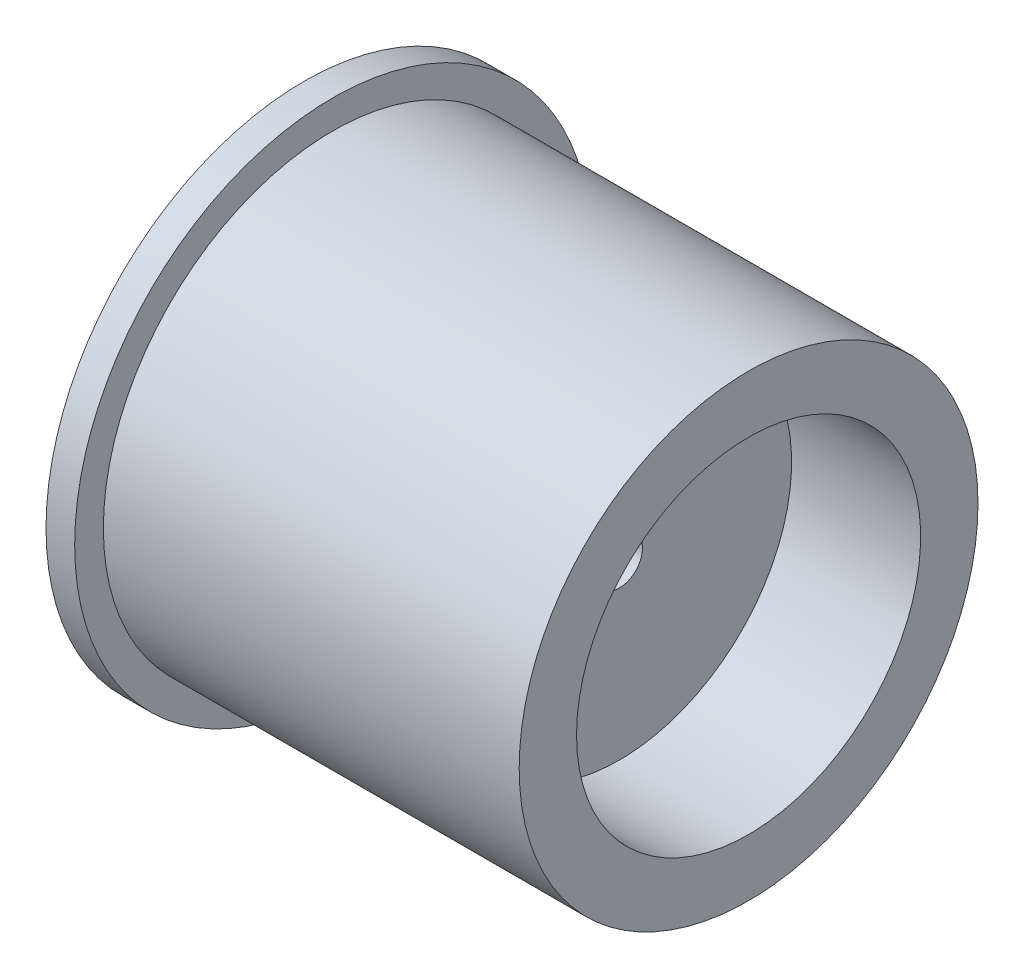
ISO-10303-21;
HEADER;
FILE_DESCRIPTION(('STEP AP214'),'2;1');
FILE_NAME('part.step','',(''),(''),'','','');
FILE_SCHEMA(('AUTOMOTIVE_DESIGN { 1 0 10303 214 1 1 1 1 }'));
ENDSEC;
DATA;
#1=APPLICATION_CONTEXT('core data for automotive mechanical design processes');
#2=APPLICATION_PROTOCOL_DEFINITION('international standard','automotive_design',2000,#1);
#3=PRODUCT_CONTEXT('',#1,'mechanical');
#4=PRODUCT('Part','Part','',(#3));
#5=PRODUCT_RELATED_PRODUCT_CATEGORY('part','',(#4));
#6=PRODUCT_DEFINITION_FORMATION('','',#4);
#7=PRODUCT_DEFINITION_CONTEXT('part definition',#1,'design');
#8=PRODUCT_DEFINITION('design','',#6,#7);
#9=PRODUCT_DEFINITION_SHAPE('','',#8);
#10=(LENGTH_UNIT() NAMED_UNIT(*) SI_UNIT(.MILLI.,.METRE.));
#11=(NAMED_UNIT(*) PLANE_ANGLE_UNIT() SI_UNIT($,.RADIAN.));
#12=(NAMED_UNIT(*) SI_UNIT($,.STERADIAN.) SOLID_ANGLE_UNIT());
#13=UNCERTAINTY_MEASURE_WITH_UNIT(LENGTH_MEASURE(1.E-05),#10,'distance_accuracy_value','');
#14=(GEOMETRIC_REPRESENTATION_CONTEXT(3) GLOBAL_UNCERTAINTY_ASSIGNED_CONTEXT((#13)) GLOBAL_UNIT_ASSIGNED_CONTEXT((#10,
#11,#12)) REPRESENTATION_CONTEXT('',''));
#15=CARTESIAN_POINT('',(0.,0.,0.));
#16=DIRECTION('',(0.,0.,1.));
#17=DIRECTION('',(1.,0.,0.));
#18=AXIS2_PLACEMENT_3D('',#15,#16,#17);
#19=CARTESIAN_POINT('',(-7.,13.,0.));
#20=DIRECTION('',(1.,0.,0.));
#21=DIRECTION('',(0.,0.,-1.));
#22=AXIS2_PLACEMENT_3D('',#19,#20,#21);
#23=PLANE('',#22);
#24=CARTESIAN_POINT('',(-7.,0.,0.));
#25=DIRECTION('',(-1.,0.,0.));
#26=DIRECTION('',(0.,0.,1.));
#27=AXIS2_PLACEMENT_3D('',#24,#25,#26);
#28=CIRCLE('',#27,13.);
#29=CARTESIAN_POINT('',(-7.,0.,13.));
#30=VERTEX_POINT('',#29);
#31=EDGE_CURVE('E143',#30,#30,#28,.T.);
#32=ORIENTED_EDGE('',*,*,#31,.T.);
#33=EDGE_LOOP('',(#32));
#34=FACE_BOUND('',#33,.T.);
#35=DIRECTION('',(0.,0.866025403784439,0.5));
#36=VECTOR('',#35,1.);
#37=CARTESIAN_POINT('',(-7.,12.875,0.216506350946108));
#38=LINE('',#37,#36);
#39=CARTESIAN_POINT('',(-7.,0.,-7.21687836487032));
#40=VERTEX_POINT('',#39);
#41=CARTESIAN_POINT('',(-7.,6.25,-3.60843918243516));
#42=VERTEX_POINT('',#41);
#43=EDGE_CURVE('E51',#40,#42,#38,.T.);
#44=ORIENTED_EDGE('',*,*,#43,.T.);
#45=DIRECTION('',(0.,0.,1.));
#46=VECTOR('',#45,1.);
#47=CARTESIAN_POINT('',(-7.,6.25,0.));
#48=LINE('',#47,#46);
#49=CARTESIAN_POINT('',(-7.,6.25,3.60843918243516));
#50=VERTEX_POINT('',#49);
#51=EDGE_CURVE('E123',#42,#50,#48,.T.);
#52=ORIENTED_EDGE('',*,*,#51,.T.);
#53=DIRECTION('',(0.,-0.866025403784439,0.5));
#54=VECTOR('',#53,1.);
#55=CARTESIAN_POINT('',(-7.,12.875,-0.216506350946107));
#56=LINE('',#55,#54);
#57=CARTESIAN_POINT('',(-7.,0.,7.21687836487032));
#58=VERTEX_POINT('',#57);
#59=EDGE_CURVE('E126',#50,#58,#56,.T.);
#60=ORIENTED_EDGE('',*,*,#59,.T.);
#61=DIRECTION('',(0.,-0.866025403784439,-0.5));
#62=VECTOR('',#61,1.);
#63=CARTESIAN_POINT('',(-7.,6.62499999999999,11.0418238982516));
#64=LINE('',#63,#62);
#65=CARTESIAN_POINT('',(-7.,-6.25,3.60843918243515));
#66=VERTEX_POINT('',#65);
#67=EDGE_CURVE('E129',#58,#66,#64,.T.);
#68=ORIENTED_EDGE('',*,*,#67,.T.);
#69=DIRECTION('',(0.,0.,-1.));
#70=VECTOR('',#69,1.);
#71=CARTESIAN_POINT('',(-7.,-6.25,0.));
#72=LINE('',#71,#70);
#73=CARTESIAN_POINT('',(-7.,-6.25,-3.60843918243516));
#74=VERTEX_POINT('',#73);
#75=EDGE_CURVE('E112',#66,#74,#72,.T.);
#76=ORIENTED_EDGE('',*,*,#75,.T.);
#77=DIRECTION('',(0.,0.866025403784439,-0.5));
#78=VECTOR('',#77,1.);
#79=CARTESIAN_POINT('',(-7.,6.62500000000001,-11.0418238982516));
#80=LINE('',#79,#78);
#81=EDGE_CURVE('E132',#74,#40,#80,.T.);
#82=ORIENTED_EDGE('',*,*,#81,.T.);
#83=EDGE_LOOP('',(#44,#52,#60,#68,#76,#82));
#84=FACE_BOUND('',#83,.T.);
#85=ADVANCED_FACE('F36',(#34,#84),#23,.F.);
#86=CARTESIAN_POINT('',(0.,0.,0.));
#87=DIRECTION('',(-1.,0.,0.));
#88=DIRECTION('',(0.,0.,1.));
#89=AXIS2_PLACEMENT_3D('',#86,#87,#88);
#90=CYLINDRICAL_SURFACE('',#89,1.6);
#91=CARTESIAN_POINT('',(-1.,0.,0.));
#92=DIRECTION('',(1.,0.,0.));
#93=DIRECTION('',(0.,0.,-1.));
#94=AXIS2_PLACEMENT_3D('',#91,#92,#93);
#95=CIRCLE('',#94,1.6);
#96=CARTESIAN_POINT('',(-1.,0.,-1.6));
#97=VERTEX_POINT('',#96);
#98=EDGE_CURVE('E39',#97,#97,#95,.F.);
#99=ORIENTED_EDGE('',*,*,#98,.T.);
#100=EDGE_LOOP('',(#99));
#101=FACE_BOUND('',#100,.T.);
#102=CARTESIAN_POINT('',(6.,0.,0.));
#103=DIRECTION('',(-1.,0.,0.));
#104=DIRECTION('',(0.,0.,1.));
#105=AXIS2_PLACEMENT_3D('',#102,#103,#104);
#106=CIRCLE('',#105,1.6);
#107=CARTESIAN_POINT('',(6.,0.,1.6));
#108=VERTEX_POINT('',#107);
#109=EDGE_CURVE('E11',#108,#108,#106,.T.);
#110=ORIENTED_EDGE('',*,*,#109,.F.);
#111=EDGE_LOOP('',(#110));
#112=FACE_BOUND('',#111,.T.);
#113=ADVANCED_FACE('F172',(#101,#112),#90,.F.);
#114=CARTESIAN_POINT('',(6.,1.6,0.));
#115=DIRECTION('',(-1.,0.,0.));
#116=DIRECTION('',(0.,0.,1.));
#117=AXIS2_PLACEMENT_3D('',#114,#115,#116);
#118=PLANE('',#117);
#119=CARTESIAN_POINT('',(6.,0.,0.));
#120=DIRECTION('',(-1.,0.,0.));
#121=DIRECTION('',(0.,0.,1.));
#122=AXIS2_PLACEMENT_3D('',#119,#120,#121);
#123=CIRCLE('',#122,12.);
#124=CARTESIAN_POINT('',(6.,0.,12.));
#125=VERTEX_POINT('',#124);
#126=EDGE_CURVE('E44',#125,#125,#123,.T.);
#127=ORIENTED_EDGE('',*,*,#126,.F.);
#128=EDGE_LOOP('',(#127));
#129=FACE_BOUND('',#128,.T.);
#130=ORIENTED_EDGE('',*,*,#109,.T.);
#131=EDGE_LOOP('',(#130));
#132=FACE_BOUND('',#131,.T.);
#133=ADVANCED_FACE('F169',(#129,#132),#118,.F.);
#134=CARTESIAN_POINT('',(0.,0.,0.));
#135=DIRECTION('',(-1.,0.,0.));
#136=DIRECTION('',(0.,0.,1.));
#137=AXIS2_PLACEMENT_3D('',#134,#135,#136);
#138=CYLINDRICAL_SURFACE('',#137,12.);
#139=CARTESIAN_POINT('',(15.,0.,0.));
#140=DIRECTION('',(-1.,0.,0.));
#141=DIRECTION('',(0.,0.,1.));
#142=AXIS2_PLACEMENT_3D('',#139,#140,#141);
#143=CIRCLE('',#142,12.);
#144=CARTESIAN_POINT('',(15.,0.,12.));
#145=VERTEX_POINT('',#144);
#146=EDGE_CURVE('E161',#145,#145,#143,.T.);
#147=ORIENTED_EDGE('',*,*,#146,.F.);
#148=EDGE_LOOP('',(#147));
#149=FACE_BOUND('',#148,.T.);
#150=ORIENTED_EDGE('',*,*,#126,.T.);
#151=EDGE_LOOP('',(#150));
#152=FACE_BOUND('',#151,.T.);
#153=ADVANCED_FACE('F167',(#149,#152),#138,.F.);
#154=CARTESIAN_POINT('',(15.,12.,0.));
#155=DIRECTION('',(-1.,0.,0.));
#156=DIRECTION('',(0.,0.,1.));
#157=AXIS2_PLACEMENT_3D('',#154,#155,#156);
#158=PLANE('',#157);
#159=CARTESIAN_POINT('',(15.,0.,0.));
#160=DIRECTION('',(-1.,0.,0.));
#161=DIRECTION('',(0.,0.,1.));
#162=AXIS2_PLACEMENT_3D('',#159,#160,#161);
#163=CIRCLE('',#162,16.);
#164=CARTESIAN_POINT('',(15.,0.,16.));
#165=VERTEX_POINT('',#164);
#166=EDGE_CURVE('E158',#165,#165,#163,.T.);
#167=ORIENTED_EDGE('',*,*,#166,.F.);
#168=EDGE_LOOP('',(#167));
#169=FACE_BOUND('',#168,.T.);
#170=ORIENTED_EDGE('',*,*,#146,.T.);
#171=EDGE_LOOP('',(#170));
#172=FACE_BOUND('',#171,.T.);
#173=ADVANCED_FACE('F186',(#169,#172),#158,.F.);
#174=CARTESIAN_POINT('',(0.,0.,0.));
#175=DIRECTION('',(-1.,0.,0.));
#176=DIRECTION('',(0.,0.,1.));
#177=AXIS2_PLACEMENT_3D('',#174,#175,#176);
#178=CYLINDRICAL_SURFACE('',#177,16.);
#179=CARTESIAN_POINT('',(-14.,0.,0.));
#180=DIRECTION('',(-1.,0.,0.));
#181=DIRECTION('',(0.,0.,1.));
#182=AXIS2_PLACEMENT_3D('',#179,#180,#181);
#183=CIRCLE('',#182,16.);
#184=CARTESIAN_POINT('',(-14.,0.,16.));
#185=VERTEX_POINT('',#184);
#186=EDGE_CURVE('E155',#185,#185,#183,.T.);
#187=ORIENTED_EDGE('',*,*,#186,.F.);
#188=EDGE_LOOP('',(#187));
#189=FACE_BOUND('',#188,.T.);
#190=ORIENTED_EDGE('',*,*,#166,.T.);
#191=EDGE_LOOP('',(#190));
#192=FACE_BOUND('',#191,.T.);
#193=ADVANCED_FACE('F190',(#189,#192),#178,.T.);
#194=CARTESIAN_POINT('',(-14.,16.,0.));
#195=DIRECTION('',(-1.,0.,0.));
#196=DIRECTION('',(0.,0.,1.));
#197=AXIS2_PLACEMENT_3D('',#194,#195,#196);
#198=PLANE('',#197);
#199=CARTESIAN_POINT('',(-14.,0.,0.));
#200=DIRECTION('',(-1.,0.,0.));
#201=DIRECTION('',(0.,0.,1.));
#202=AXIS2_PLACEMENT_3D('',#199,#200,#201);
#203=CIRCLE('',#202,18.);
#204=CARTESIAN_POINT('',(-14.,0.,18.));
#205=VERTEX_POINT('',#204);
#206=EDGE_CURVE('E152',#205,#205,#203,.T.);
#207=ORIENTED_EDGE('',*,*,#206,.F.);
#208=EDGE_LOOP('',(#207));
#209=FACE_BOUND('',#208,.T.);
#210=ORIENTED_EDGE('',*,*,#186,.T.);
#211=EDGE_LOOP('',(#210));
#212=FACE_BOUND('',#211,.T.);
#213=ADVANCED_FACE('F194',(#209,#212),#198,.F.);
#214=CARTESIAN_POINT('',(0.,0.,0.));
#215=DIRECTION('',(-1.,0.,0.));
#216=DIRECTION('',(0.,0.,1.));
#217=AXIS2_PLACEMENT_3D('',#214,#215,#216);
#218=CYLINDRICAL_SURFACE('',#217,18.);
#219=CARTESIAN_POINT('',(-16.,0.,0.));
#220=DIRECTION('',(-1.,0.,0.));
#221=DIRECTION('',(0.,0.,1.));
#222=AXIS2_PLACEMENT_3D('',#219,#220,#221);
#223=CIRCLE('',#222,18.);
#224=CARTESIAN_POINT('',(-16.,0.,18.));
#225=VERTEX_POINT('',#224);
#226=EDGE_CURVE('E149',#225,#225,#223,.T.);
#227=ORIENTED_EDGE('',*,*,#226,.F.);
#228=EDGE_LOOP('',(#227));
#229=FACE_BOUND('',#228,.T.);
#230=ORIENTED_EDGE('',*,*,#206,.T.);
#231=EDGE_LOOP('',(#230));
#232=FACE_BOUND('',#231,.T.);
#233=ADVANCED_FACE('F198',(#229,#232),#218,.T.);
#234=CARTESIAN_POINT('',(-16.,18.,0.));
#235=DIRECTION('',(1.,0.,0.));
#236=DIRECTION('',(0.,0.,-1.));
#237=AXIS2_PLACEMENT_3D('',#234,#235,#236);
#238=PLANE('',#237);
#239=CARTESIAN_POINT('',(-16.,0.,0.));
#240=DIRECTION('',(-1.,0.,0.));
#241=DIRECTION('',(0.,0.,1.));
#242=AXIS2_PLACEMENT_3D('',#239,#240,#241);
#243=CIRCLE('',#242,13.);
#244=CARTESIAN_POINT('',(-16.,0.,13.));
#245=VERTEX_POINT('',#244);
#246=EDGE_CURVE('E146',#245,#245,#243,.T.);
#247=ORIENTED_EDGE('',*,*,#246,.F.);
#248=EDGE_LOOP('',(#247));
#249=FACE_BOUND('',#248,.T.);
#250=ORIENTED_EDGE('',*,*,#226,.T.);
#251=EDGE_LOOP('',(#250));
#252=FACE_BOUND('',#251,.T.);
#253=ADVANCED_FACE('F202',(#249,#252),#238,.F.);
#254=CARTESIAN_POINT('',(0.,0.,0.));
#255=DIRECTION('',(-1.,0.,0.));
#256=DIRECTION('',(0.,0.,1.));
#257=AXIS2_PLACEMENT_3D('',#254,#255,#256);
#258=CYLINDRICAL_SURFACE('',#257,13.);
#259=ORIENTED_EDGE('',*,*,#31,.F.);
#260=EDGE_LOOP('',(#259));
#261=FACE_BOUND('',#260,.T.);
#262=ORIENTED_EDGE('',*,*,#246,.T.);
#263=EDGE_LOOP('',(#262));
#264=FACE_BOUND('',#263,.T.);
#265=ADVANCED_FACE('F206',(#261,#264),#258,.F.);
#266=CARTESIAN_POINT('',(-1.,0.,0.));
#267=DIRECTION('',(1.,0.,0.));
#268=DIRECTION('',(0.,0.,-1.));
#269=AXIS2_PLACEMENT_3D('',#266,#267,#268);
#270=PLANE('',#269);
#271=DIRECTION('',(0.,0.866025403784439,0.5));
#272=VECTOR('',#271,1.);
#273=CARTESIAN_POINT('',(-1.,12.875,0.216506350946108));
#274=LINE('',#273,#272);
#275=CARTESIAN_POINT('',(-1.,0.,-7.21687836487032));
#276=VERTEX_POINT('',#275);
#277=CARTESIAN_POINT('',(-1.,6.25,-3.60843918243516));
#278=VERTEX_POINT('',#277);
#279=EDGE_CURVE('E135',#276,#278,#274,.T.);
#280=ORIENTED_EDGE('',*,*,#279,.F.);
#281=DIRECTION('',(0.,0.866025403784439,-0.5));
#282=VECTOR('',#281,1.);
#283=CARTESIAN_POINT('',(-1.,6.62500000000001,-11.0418238982516));
#284=LINE('',#283,#282);
#285=CARTESIAN_POINT('',(-1.,-6.25,-3.60843918243516));
#286=VERTEX_POINT('',#285);
#287=EDGE_CURVE('E59',#286,#276,#284,.T.);
#288=ORIENTED_EDGE('',*,*,#287,.F.);
#289=DIRECTION('',(0.,0.,-1.));
#290=VECTOR('',#289,1.);
#291=CARTESIAN_POINT('',(-1.,-6.25,0.));
#292=LINE('',#291,#290);
#293=CARTESIAN_POINT('',(-1.,-6.25,3.60843918243515));
#294=VERTEX_POINT('',#293);
#295=EDGE_CURVE('E107',#294,#286,#292,.T.);
#296=ORIENTED_EDGE('',*,*,#295,.F.);
#297=DIRECTION('',(0.,-0.866025403784439,-0.5));
#298=VECTOR('',#297,1.);
#299=CARTESIAN_POINT('',(-1.,6.62499999999999,11.0418238982516));
#300=LINE('',#299,#298);
#301=CARTESIAN_POINT('',(-1.,0.,7.21687836487032));
#302=VERTEX_POINT('',#301);
#303=EDGE_CURVE('E100',#302,#294,#300,.T.);
#304=ORIENTED_EDGE('',*,*,#303,.F.);
#305=DIRECTION('',(0.,-0.866025403784439,0.5));
#306=VECTOR('',#305,1.);
#307=CARTESIAN_POINT('',(-1.,12.875,-0.216506350946107));
#308=LINE('',#307,#306);
#309=CARTESIAN_POINT('',(-1.,6.25,3.60843918243516));
#310=VERTEX_POINT('',#309);
#311=EDGE_CURVE('E108',#310,#302,#308,.T.);
#312=ORIENTED_EDGE('',*,*,#311,.F.);
#313=DIRECTION('',(0.,0.,1.));
#314=VECTOR('',#313,1.);
#315=CARTESIAN_POINT('',(-1.,6.25,0.));
#316=LINE('',#315,#314);
#317=EDGE_CURVE('E90',#278,#310,#316,.T.);
#318=ORIENTED_EDGE('',*,*,#317,.F.);
#319=EDGE_LOOP('',(#280,#288,#296,#304,#312,#318));
#320=FACE_BOUND('',#319,.T.);
#321=ORIENTED_EDGE('',*,*,#98,.F.);
#322=EDGE_LOOP('',(#321));
#323=FACE_BOUND('',#322,.T.);
#324=ADVANCED_FACE('F115',(#320,#323),#270,.F.);
#325=CARTESIAN_POINT('',(-1.,12.875,0.216506350946108));
#326=DIRECTION('',(0.,-0.5,0.866025403784439));
#327=DIRECTION('',(0.,-0.866025403784439,-0.5));
#328=AXIS2_PLACEMENT_3D('',#325,#326,#327);
#329=PLANE('',#328);
#330=ORIENTED_EDGE('',*,*,#43,.F.);
#331=DIRECTION('',(-1.,0.,0.));
#332=VECTOR('',#331,1.);
#333=CARTESIAN_POINT('',(-1.,0.,-7.21687836487032));
#334=LINE('',#333,#332);
#335=EDGE_CURVE('E118',#276,#40,#334,.T.);
#336=ORIENTED_EDGE('',*,*,#335,.F.);
#337=ORIENTED_EDGE('',*,*,#279,.T.);
#338=DIRECTION('',(-1.,0.,0.));
#339=VECTOR('',#338,1.);
#340=CARTESIAN_POINT('',(-1.,6.25,-3.60843918243516));
#341=LINE('',#340,#339);
#342=EDGE_CURVE('E141',#278,#42,#341,.T.);
#343=ORIENTED_EDGE('',*,*,#342,.T.);
#344=EDGE_LOOP('',(#330,#336,#337,#343));
#345=FACE_BOUND('',#344,.T.);
#346=ADVANCED_FACE('F211',(#345),#329,.T.);
#347=CARTESIAN_POINT('',(-1.,6.25,0.));
#348=DIRECTION('',(0.,-1.,0.));
#349=DIRECTION('',(0.,0.,-1.));
#350=AXIS2_PLACEMENT_3D('',#347,#348,#349);
#351=PLANE('',#350);
#352=ORIENTED_EDGE('',*,*,#51,.F.);
#353=ORIENTED_EDGE('',*,*,#342,.F.);
#354=ORIENTED_EDGE('',*,*,#317,.T.);
#355=DIRECTION('',(-1.,0.,0.));
#356=VECTOR('',#355,1.);
#357=CARTESIAN_POINT('',(-1.,6.25,3.60843918243516));
#358=LINE('',#357,#356);
#359=EDGE_CURVE('E139',#310,#50,#358,.T.);
#360=ORIENTED_EDGE('',*,*,#359,.T.);
#361=EDGE_LOOP('',(#352,#353,#354,#360));
#362=FACE_BOUND('',#361,.T.);
#363=ADVANCED_FACE('F214',(#362),#351,.T.);
#364=CARTESIAN_POINT('',(-1.,12.875,-0.216506350946107));
#365=DIRECTION('',(0.,-0.5,-0.866025403784439));
#366=DIRECTION('',(0.,0.866025403784439,-0.5));
#367=AXIS2_PLACEMENT_3D('',#364,#365,#366);
#368=PLANE('',#367);
#369=ORIENTED_EDGE('',*,*,#59,.F.);
#370=ORIENTED_EDGE('',*,*,#359,.F.);
#371=ORIENTED_EDGE('',*,*,#311,.T.);
#372=DIRECTION('',(-1.,0.,0.));
#373=VECTOR('',#372,1.);
#374=CARTESIAN_POINT('',(-1.,0.,7.21687836487032));
#375=LINE('',#374,#373);
#376=EDGE_CURVE('E105',#302,#58,#375,.T.);
#377=ORIENTED_EDGE('',*,*,#376,.T.);
#378=EDGE_LOOP('',(#369,#370,#371,#377));
#379=FACE_BOUND('',#378,.T.);
#380=ADVANCED_FACE('F217',(#379),#368,.T.);
#381=CARTESIAN_POINT('',(-1.,6.62499999999999,11.0418238982516));
#382=DIRECTION('',(0.,0.5,-0.866025403784438));
#383=DIRECTION('',(0.,0.866025403784439,0.5));
#384=AXIS2_PLACEMENT_3D('',#381,#382,#383);
#385=PLANE('',#384);
#386=ORIENTED_EDGE('',*,*,#67,.F.);
#387=ORIENTED_EDGE('',*,*,#376,.F.);
#388=ORIENTED_EDGE('',*,*,#303,.T.);
#389=DIRECTION('',(-1.,0.,0.));
#390=VECTOR('',#389,1.);
#391=CARTESIAN_POINT('',(-1.,-6.25,3.60843918243515));
#392=LINE('',#391,#390);
#393=EDGE_CURVE('E104',#294,#66,#392,.T.);
#394=ORIENTED_EDGE('',*,*,#393,.T.);
#395=EDGE_LOOP('',(#386,#387,#388,#394));
#396=FACE_BOUND('',#395,.T.);
#397=ADVANCED_FACE('F103',(#396),#385,.T.);
#398=CARTESIAN_POINT('',(-1.,-6.25,0.));
#399=DIRECTION('',(0.,1.,0.));
#400=DIRECTION('',(0.,0.,1.));
#401=AXIS2_PLACEMENT_3D('',#398,#399,#400);
#402=PLANE('',#401);
#403=ORIENTED_EDGE('',*,*,#75,.F.);
#404=ORIENTED_EDGE('',*,*,#393,.F.);
#405=ORIENTED_EDGE('',*,*,#295,.T.);
#406=DIRECTION('',(-1.,0.,0.));
#407=VECTOR('',#406,1.);
#408=CARTESIAN_POINT('',(-1.,-6.25,-3.60843918243516));
#409=LINE('',#408,#407);
#410=EDGE_CURVE('E81',#286,#74,#409,.T.);
#411=ORIENTED_EDGE('',*,*,#410,.T.);
#412=EDGE_LOOP('',(#403,#404,#405,#411));
#413=FACE_BOUND('',#412,.T.);
#414=ADVANCED_FACE('F110',(#413),#402,.T.);
#415=CARTESIAN_POINT('',(-1.,6.62500000000001,-11.0418238982516));
#416=DIRECTION('',(0.,0.5,0.866025403784439));
#417=DIRECTION('',(0.,-0.866025403784439,0.5));
#418=AXIS2_PLACEMENT_3D('',#415,#416,#417);
#419=PLANE('',#418);
#420=ORIENTED_EDGE('',*,*,#81,.F.);
#421=ORIENTED_EDGE('',*,*,#410,.F.);
#422=ORIENTED_EDGE('',*,*,#287,.T.);
#423=ORIENTED_EDGE('',*,*,#335,.T.);
#424=EDGE_LOOP('',(#420,#421,#422,#423));
#425=FACE_BOUND('',#424,.T.);
#426=ADVANCED_FACE('F226',(#425),#419,.T.);
#427=CLOSED_SHELL('',(#85,#113,#133,#153,#173,#193,#213,#233,#253,#265,#324,#346,#363,#380,#397,
#414,#426));
#428=MANIFOLD_SOLID_BREP('B2',#427);
#429=ADVANCED_BREP_SHAPE_REPRESENTATION('',(#18,#428),#14);
#430=SHAPE_DEFINITION_REPRESENTATION(#9,#429);
ENDSEC;
END-ISO-10303-21;
